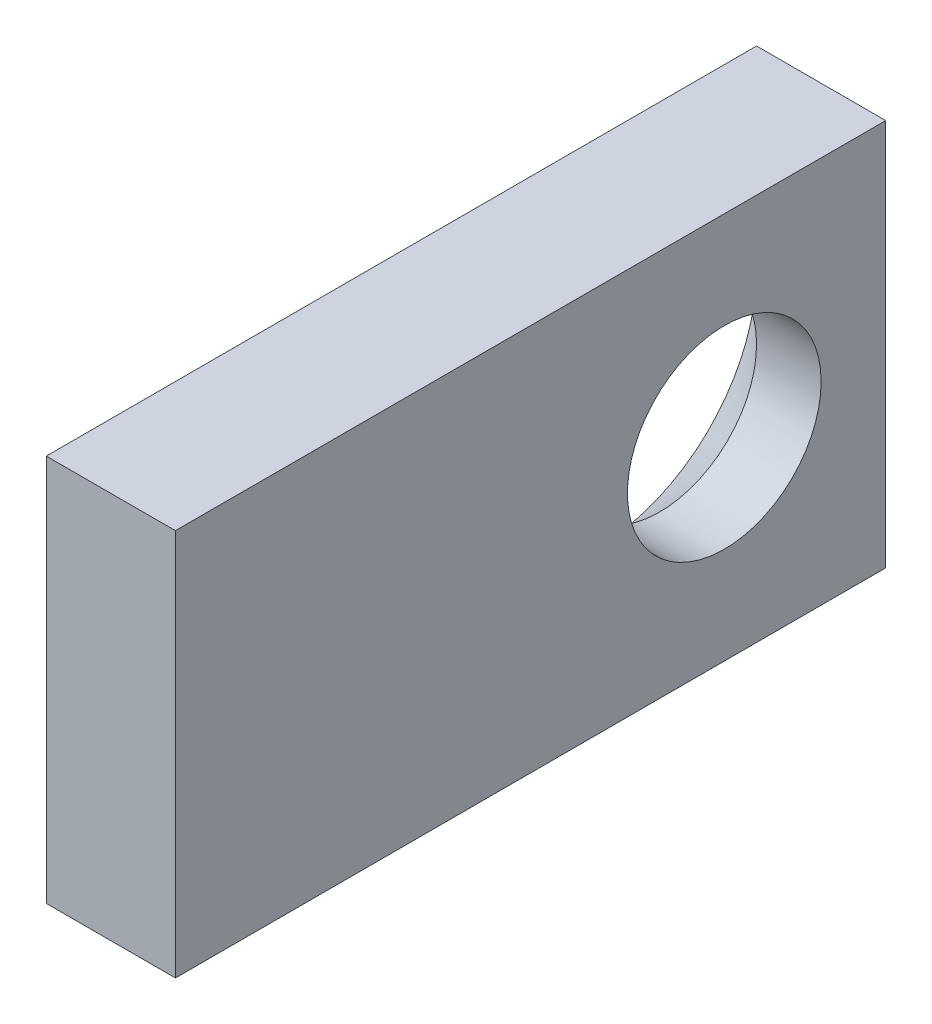
ISO-10303-21;
HEADER;
FILE_DESCRIPTION(('STEP AP214'),'2;1');
FILE_NAME('part.step','',(''),(''),'','','');
FILE_SCHEMA(('AUTOMOTIVE_DESIGN { 1 0 10303 214 1 1 1 1 }'));
ENDSEC;
DATA;
#1=APPLICATION_CONTEXT('core data for automotive mechanical design processes');
#2=APPLICATION_PROTOCOL_DEFINITION('international standard','automotive_design',2000,#1);
#3=PRODUCT_CONTEXT('',#1,'mechanical');
#4=PRODUCT('Part','Part','',(#3));
#5=PRODUCT_RELATED_PRODUCT_CATEGORY('part','',(#4));
#6=PRODUCT_DEFINITION_FORMATION('','',#4);
#7=PRODUCT_DEFINITION_CONTEXT('part definition',#1,'design');
#8=PRODUCT_DEFINITION('design','',#6,#7);
#9=PRODUCT_DEFINITION_SHAPE('','',#8);
#10=(LENGTH_UNIT() NAMED_UNIT(*) SI_UNIT(.MILLI.,.METRE.));
#11=(NAMED_UNIT(*) PLANE_ANGLE_UNIT() SI_UNIT($,.RADIAN.));
#12=(NAMED_UNIT(*) SI_UNIT($,.STERADIAN.) SOLID_ANGLE_UNIT());
#13=UNCERTAINTY_MEASURE_WITH_UNIT(LENGTH_MEASURE(1.E-05),#10,'distance_accuracy_value','');
#14=(GEOMETRIC_REPRESENTATION_CONTEXT(3) GLOBAL_UNCERTAINTY_ASSIGNED_CONTEXT((#13)) GLOBAL_UNIT_ASSIGNED_CONTEXT((#10,
#11,#12)) REPRESENTATION_CONTEXT('',''));
#15=CARTESIAN_POINT('',(0.,0.,0.));
#16=DIRECTION('',(0.,0.,1.));
#17=DIRECTION('',(1.,0.,0.));
#18=AXIS2_PLACEMENT_3D('',#15,#16,#17);
#19=CARTESIAN_POINT('',(2.,0.,0.));
#20=DIRECTION('',(0.,-1.,0.));
#21=DIRECTION('',(0.,0.,-1.));
#22=AXIS2_PLACEMENT_3D('',#19,#20,#21);
#23=PLANE('',#22);
#24=DIRECTION('',(0.,0.,1.));
#25=VECTOR('',#24,1.);
#26=CARTESIAN_POINT('',(0.,0.,0.));
#27=LINE('',#26,#25);
#28=CARTESIAN_POINT('',(0.,0.,0.));
#29=VERTEX_POINT('',#28);
#30=CARTESIAN_POINT('',(0.,0.,11.));
#31=VERTEX_POINT('',#30);
#32=EDGE_CURVE('E117',#29,#31,#27,.T.);
#33=ORIENTED_EDGE('',*,*,#32,.F.);
#34=DIRECTION('',(-1.,0.,0.));
#35=VECTOR('',#34,1.);
#36=CARTESIAN_POINT('',(2.,0.,0.));
#37=LINE('',#36,#35);
#38=CARTESIAN_POINT('',(2.,0.,0.));
#39=VERTEX_POINT('',#38);
#40=EDGE_CURVE('E79',#39,#29,#37,.T.);
#41=ORIENTED_EDGE('',*,*,#40,.F.);
#42=DIRECTION('',(0.,0.,1.));
#43=VECTOR('',#42,1.);
#44=CARTESIAN_POINT('',(2.,0.,0.));
#45=LINE('',#44,#43);
#46=CARTESIAN_POINT('',(2.,0.,11.));
#47=VERTEX_POINT('',#46);
#48=EDGE_CURVE('E99',#39,#47,#45,.T.);
#49=ORIENTED_EDGE('',*,*,#48,.T.);
#50=DIRECTION('',(-1.,0.,0.));
#51=VECTOR('',#50,1.);
#52=CARTESIAN_POINT('',(2.,0.,11.));
#53=LINE('',#52,#51);
#54=EDGE_CURVE('E57',#47,#31,#53,.T.);
#55=ORIENTED_EDGE('',*,*,#54,.T.);
#56=EDGE_LOOP('',(#33,#41,#49,#55));
#57=FACE_BOUND('',#56,.T.);
#58=ADVANCED_FACE('F37',(#57),#23,.T.);
#59=CARTESIAN_POINT('',(2.,0.,0.));
#60=DIRECTION('',(0.,0.,1.));
#61=DIRECTION('',(1.,0.,0.));
#62=AXIS2_PLACEMENT_3D('',#59,#60,#61);
#63=PLANE('',#62);
#64=DIRECTION('',(0.,1.,0.));
#65=VECTOR('',#64,1.);
#66=CARTESIAN_POINT('',(0.,0.,0.));
#67=LINE('',#66,#65);
#68=CARTESIAN_POINT('',(0.,3.,0.));
#69=VERTEX_POINT('',#68);
#70=EDGE_CURVE('E114',#29,#69,#67,.T.);
#71=ORIENTED_EDGE('',*,*,#70,.T.);
#72=CARTESIAN_POINT('',(0.,6.,0.));
#73=VERTEX_POINT('',#72);
#74=EDGE_CURVE('E105',#69,#73,#67,.T.);
#75=ORIENTED_EDGE('',*,*,#74,.T.);
#76=DIRECTION('',(-1.,0.,0.));
#77=VECTOR('',#76,1.);
#78=CARTESIAN_POINT('',(2.,6.,0.));
#79=LINE('',#78,#77);
#80=CARTESIAN_POINT('',(2.,6.,0.));
#81=VERTEX_POINT('',#80);
#82=EDGE_CURVE('E90',#81,#73,#79,.T.);
#83=ORIENTED_EDGE('',*,*,#82,.F.);
#84=DIRECTION('',(0.,1.,0.));
#85=VECTOR('',#84,1.);
#86=CARTESIAN_POINT('',(2.,0.,0.));
#87=LINE('',#86,#85);
#88=EDGE_CURVE('E95',#39,#81,#87,.T.);
#89=ORIENTED_EDGE('',*,*,#88,.F.);
#90=ORIENTED_EDGE('',*,*,#40,.T.);
#91=EDGE_LOOP('',(#71,#75,#83,#89,#90));
#92=FACE_BOUND('',#91,.T.);
#93=ADVANCED_FACE('F103',(#92),#63,.F.);
#94=CARTESIAN_POINT('',(2.,6.,0.));
#95=DIRECTION('',(0.,-1.,0.));
#96=DIRECTION('',(0.,0.,-1.));
#97=AXIS2_PLACEMENT_3D('',#94,#95,#96);
#98=PLANE('',#97);
#99=DIRECTION('',(0.,0.,1.));
#100=VECTOR('',#99,1.);
#101=CARTESIAN_POINT('',(0.,6.,0.));
#102=LINE('',#101,#100);
#103=CARTESIAN_POINT('',(0.,6.,11.));
#104=VERTEX_POINT('',#103);
#105=EDGE_CURVE('E116',#73,#104,#102,.T.);
#106=ORIENTED_EDGE('',*,*,#105,.T.);
#107=DIRECTION('',(-1.,0.,0.));
#108=VECTOR('',#107,1.);
#109=CARTESIAN_POINT('',(2.,6.,11.));
#110=LINE('',#109,#108);
#111=CARTESIAN_POINT('',(2.,6.,11.));
#112=VERTEX_POINT('',#111);
#113=EDGE_CURVE('E91',#112,#104,#110,.T.);
#114=ORIENTED_EDGE('',*,*,#113,.F.);
#115=DIRECTION('',(0.,0.,1.));
#116=VECTOR('',#115,1.);
#117=CARTESIAN_POINT('',(2.,6.,0.));
#118=LINE('',#117,#116);
#119=EDGE_CURVE('E85',#81,#112,#118,.T.);
#120=ORIENTED_EDGE('',*,*,#119,.F.);
#121=ORIENTED_EDGE('',*,*,#82,.T.);
#122=EDGE_LOOP('',(#106,#114,#120,#121));
#123=FACE_BOUND('',#122,.T.);
#124=ADVANCED_FACE('F88',(#123),#98,.F.);
#125=CARTESIAN_POINT('',(2.,3.,2.5));
#126=DIRECTION('',(-1.,0.,0.));
#127=DIRECTION('',(0.,0.,1.));
#128=AXIS2_PLACEMENT_3D('',#125,#126,#127);
#129=CYLINDRICAL_SURFACE('',#128,1.5);
#130=CARTESIAN_POINT('',(1.,3.,2.5));
#131=DIRECTION('',(1.,0.,0.));
#132=DIRECTION('',(0.,0.,-1.));
#133=AXIS2_PLACEMENT_3D('',#130,#131,#132);
#134=CIRCLE('',#133,1.5);
#135=CARTESIAN_POINT('',(1.,3.,1.));
#136=VERTEX_POINT('',#135);
#137=EDGE_CURVE('E11',#136,#136,#134,.F.);
#138=ORIENTED_EDGE('',*,*,#137,.T.);
#139=EDGE_LOOP('',(#138));
#140=FACE_BOUND('',#139,.T.);
#141=CARTESIAN_POINT('',(2.,3.,2.5));
#142=DIRECTION('',(1.,0.,0.));
#143=DIRECTION('',(0.,0.,-1.));
#144=AXIS2_PLACEMENT_3D('',#141,#142,#143);
#145=CIRCLE('',#144,1.5);
#146=CARTESIAN_POINT('',(2.,3.,1.));
#147=VERTEX_POINT('',#146);
#148=EDGE_CURVE('E124',#147,#147,#145,.T.);
#149=ORIENTED_EDGE('',*,*,#148,.T.);
#150=EDGE_LOOP('',(#149));
#151=FACE_BOUND('',#150,.T.);
#152=ADVANCED_FACE('F130',(#140,#151),#129,.F.);
#153=CARTESIAN_POINT('',(2.,0.,11.));
#154=DIRECTION('',(0.,0.,1.));
#155=DIRECTION('',(1.,0.,0.));
#156=AXIS2_PLACEMENT_3D('',#153,#154,#155);
#157=PLANE('',#156);
#158=DIRECTION('',(0.,1.,0.));
#159=VECTOR('',#158,1.);
#160=CARTESIAN_POINT('',(0.,0.,11.));
#161=LINE('',#160,#159);
#162=EDGE_CURVE('E119',#31,#104,#161,.T.);
#163=ORIENTED_EDGE('',*,*,#162,.F.);
#164=ORIENTED_EDGE('',*,*,#54,.F.);
#165=DIRECTION('',(0.,1.,0.));
#166=VECTOR('',#165,1.);
#167=CARTESIAN_POINT('',(2.,0.,11.));
#168=LINE('',#167,#166);
#169=EDGE_CURVE('E94',#47,#112,#168,.T.);
#170=ORIENTED_EDGE('',*,*,#169,.T.);
#171=ORIENTED_EDGE('',*,*,#113,.T.);
#172=EDGE_LOOP('',(#163,#164,#170,#171));
#173=FACE_BOUND('',#172,.T.);
#174=ADVANCED_FACE('F133',(#173),#157,.T.);
#175=CARTESIAN_POINT('',(2.,0.,0.));
#176=DIRECTION('',(1.,0.,0.));
#177=DIRECTION('',(0.,0.,-1.));
#178=AXIS2_PLACEMENT_3D('',#175,#176,#177);
#179=PLANE('',#178);
#180=ORIENTED_EDGE('',*,*,#148,.F.);
#181=EDGE_LOOP('',(#180));
#182=FACE_BOUND('',#181,.T.);
#183=ORIENTED_EDGE('',*,*,#48,.F.);
#184=ORIENTED_EDGE('',*,*,#88,.T.);
#185=ORIENTED_EDGE('',*,*,#119,.T.);
#186=ORIENTED_EDGE('',*,*,#169,.F.);
#187=EDGE_LOOP('',(#183,#184,#185,#186));
#188=FACE_BOUND('',#187,.T.);
#189=ADVANCED_FACE('F98',(#182,#188),#179,.T.);
#190=CARTESIAN_POINT('',(0.,0.,0.));
#191=DIRECTION('',(1.,0.,0.));
#192=DIRECTION('',(0.,0.,-1.));
#193=AXIS2_PLACEMENT_3D('',#190,#191,#192);
#194=PLANE('',#193);
#195=ORIENTED_EDGE('',*,*,#74,.F.);
#196=CARTESIAN_POINT('',(0.,3.,2.5));
#197=DIRECTION('',(1.,0.,0.));
#198=DIRECTION('',(0.,0.,-1.));
#199=AXIS2_PLACEMENT_3D('',#196,#197,#198);
#200=CIRCLE('',#199,2.5);
#201=EDGE_CURVE('E45',#69,#69,#200,.T.);
#202=ORIENTED_EDGE('',*,*,#201,.T.);
#203=ORIENTED_EDGE('',*,*,#70,.F.);
#204=ORIENTED_EDGE('',*,*,#32,.T.);
#205=ORIENTED_EDGE('',*,*,#162,.T.);
#206=ORIENTED_EDGE('',*,*,#105,.F.);
#207=EDGE_LOOP('',(#195,#202,#203,#204,#205,#206));
#208=FACE_BOUND('',#207,.T.);
#209=ADVANCED_FACE('F113',(#208),#194,.F.);
#210=CARTESIAN_POINT('',(0.,3.,2.5));
#211=DIRECTION('',(-1.,0.,0.));
#212=DIRECTION('',(0.,0.,1.));
#213=AXIS2_PLACEMENT_3D('',#210,#211,#212);
#214=CONICAL_SURFACE('',#213,2.5,0.785398163397447);
#215=ORIENTED_EDGE('',*,*,#137,.F.);
#216=EDGE_LOOP('',(#215));
#217=FACE_BOUND('',#216,.T.);
#218=ORIENTED_EDGE('',*,*,#201,.F.);
#219=EDGE_LOOP('',(#218));
#220=FACE_BOUND('',#219,.T.);
#221=ADVANCED_FACE('F39',(#217,#220),#214,.F.);
#222=CLOSED_SHELL('',(#58,#93,#124,#152,#174,#189,#209,#221));
#223=MANIFOLD_SOLID_BREP('B2',#222);
#224=ADVANCED_BREP_SHAPE_REPRESENTATION('',(#18,#223),#14);
#225=SHAPE_DEFINITION_REPRESENTATION(#9,#224);
ENDSEC;
END-ISO-10303-21;
